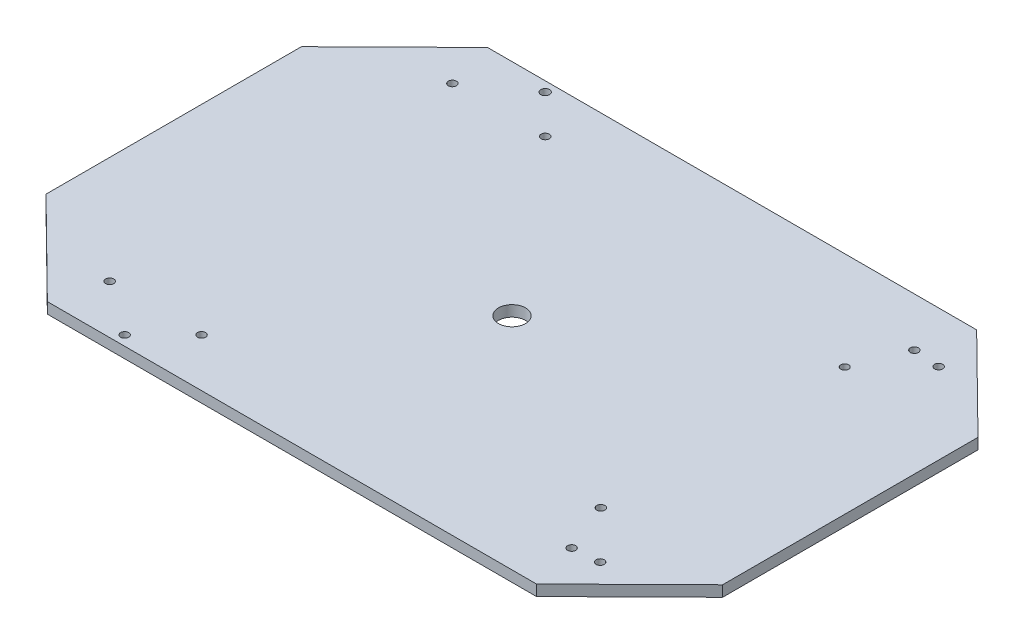
ISO-10303-21;
HEADER;
FILE_DESCRIPTION(('STEP AP214'),'2;1');
FILE_NAME('part.step','',(''),(''),'','','');
FILE_SCHEMA(('AUTOMOTIVE_DESIGN { 1 0 10303 214 1 1 1 1 }'));
ENDSEC;
DATA;
#1=APPLICATION_CONTEXT('core data for automotive mechanical design processes');
#2=APPLICATION_PROTOCOL_DEFINITION('international standard','automotive_design',2000,#1);
#3=PRODUCT_CONTEXT('',#1,'mechanical');
#4=PRODUCT('Part','Part','',(#3));
#5=PRODUCT_RELATED_PRODUCT_CATEGORY('part','',(#4));
#6=PRODUCT_DEFINITION_FORMATION('','',#4);
#7=PRODUCT_DEFINITION_CONTEXT('part definition',#1,'design');
#8=PRODUCT_DEFINITION('design','',#6,#7);
#9=PRODUCT_DEFINITION_SHAPE('','',#8);
#10=(LENGTH_UNIT() NAMED_UNIT(*) SI_UNIT(.MILLI.,.METRE.));
#11=(NAMED_UNIT(*) PLANE_ANGLE_UNIT() SI_UNIT($,.RADIAN.));
#12=(NAMED_UNIT(*) SI_UNIT($,.STERADIAN.) SOLID_ANGLE_UNIT());
#13=UNCERTAINTY_MEASURE_WITH_UNIT(LENGTH_MEASURE(1.E-05),#10,'distance_accuracy_value','');
#14=(GEOMETRIC_REPRESENTATION_CONTEXT(3) GLOBAL_UNCERTAINTY_ASSIGNED_CONTEXT((#13)) GLOBAL_UNIT_ASSIGNED_CONTEXT((#10,
#11,#12)) REPRESENTATION_CONTEXT('',''));
#15=CARTESIAN_POINT('',(0.,0.,0.));
#16=DIRECTION('',(0.,0.,1.));
#17=DIRECTION('',(1.,0.,0.));
#18=AXIS2_PLACEMENT_3D('',#15,#16,#17);
#19=CARTESIAN_POINT('',(-90.,4.,-81.));
#20=DIRECTION('',(0.701926718971864,0.,0.71224917072145));
#21=DIRECTION('',(0.71224917072145,0.,-0.701926718971864));
#22=AXIS2_PLACEMENT_3D('',#19,#20,#21);
#23=PLANE('',#22);
#24=DIRECTION('',(-0.71224917072145,0.,0.701926718971864));
#25=VECTOR('',#24,1.);
#26=CARTESIAN_POINT('',(-90.,0.,-81.));
#27=LINE('',#26,#25);
#28=CARTESIAN_POINT('',(-90.,0.,-81.));
#29=VERTEX_POINT('',#28);
#30=CARTESIAN_POINT('',(-124.5,0.,-47.));
#31=VERTEX_POINT('',#30);
#32=EDGE_CURVE('E135',#29,#31,#27,.T.);
#33=ORIENTED_EDGE('',*,*,#32,.T.);
#34=DIRECTION('',(0.,-1.,0.));
#35=VECTOR('',#34,1.);
#36=CARTESIAN_POINT('',(-124.5,4.,-47.));
#37=LINE('',#36,#35);
#38=CARTESIAN_POINT('',(-124.5,4.,-47.));
#39=VERTEX_POINT('',#38);
#40=EDGE_CURVE('E42',#39,#31,#37,.T.);
#41=ORIENTED_EDGE('',*,*,#40,.F.);
#42=DIRECTION('',(-0.71224917072145,0.,0.701926718971864));
#43=VECTOR('',#42,1.);
#44=CARTESIAN_POINT('',(-90.,4.,-81.));
#45=LINE('',#44,#43);
#46=CARTESIAN_POINT('',(-90.,4.,-81.));
#47=VERTEX_POINT('',#46);
#48=EDGE_CURVE('E95',#47,#39,#45,.T.);
#49=ORIENTED_EDGE('',*,*,#48,.F.);
#50=DIRECTION('',(0.,-1.,0.));
#51=VECTOR('',#50,1.);
#52=CARTESIAN_POINT('',(-90.,4.,-81.));
#53=LINE('',#52,#51);
#54=EDGE_CURVE('E11',#47,#29,#53,.T.);
#55=ORIENTED_EDGE('',*,*,#54,.T.);
#56=EDGE_LOOP('',(#33,#41,#49,#55));
#57=FACE_BOUND('',#56,.T.);
#58=ADVANCED_FACE('F33',(#57),#23,.F.);
#59=CARTESIAN_POINT('',(-124.5,4.,47.));
#60=DIRECTION('',(1.,0.,0.));
#61=DIRECTION('',(0.,0.,-1.));
#62=AXIS2_PLACEMENT_3D('',#59,#60,#61);
#63=PLANE('',#62);
#64=DIRECTION('',(0.,0.,1.));
#65=VECTOR('',#64,1.);
#66=CARTESIAN_POINT('',(-124.5,0.,47.));
#67=LINE('',#66,#65);
#68=CARTESIAN_POINT('',(-124.5,0.,47.));
#69=VERTEX_POINT('',#68);
#70=EDGE_CURVE('E137',#31,#69,#67,.T.);
#71=ORIENTED_EDGE('',*,*,#70,.T.);
#72=DIRECTION('',(0.,-1.,0.));
#73=VECTOR('',#72,1.);
#74=CARTESIAN_POINT('',(-124.5,4.,47.));
#75=LINE('',#74,#73);
#76=CARTESIAN_POINT('',(-124.5,4.,47.));
#77=VERTEX_POINT('',#76);
#78=EDGE_CURVE('E156',#77,#69,#75,.T.);
#79=ORIENTED_EDGE('',*,*,#78,.F.);
#80=DIRECTION('',(0.,0.,1.));
#81=VECTOR('',#80,1.);
#82=CARTESIAN_POINT('',(-124.5,4.,47.));
#83=LINE('',#82,#81);
#84=EDGE_CURVE('E218',#39,#77,#83,.T.);
#85=ORIENTED_EDGE('',*,*,#84,.F.);
#86=ORIENTED_EDGE('',*,*,#40,.T.);
#87=EDGE_LOOP('',(#71,#79,#85,#86));
#88=FACE_BOUND('',#87,.T.);
#89=ADVANCED_FACE('F238',(#88),#63,.F.);
#90=CARTESIAN_POINT('',(-90.,4.,81.));
#91=DIRECTION('',(0.701926718971864,0.,-0.71224917072145));
#92=DIRECTION('',(-0.71224917072145,0.,-0.701926718971864));
#93=AXIS2_PLACEMENT_3D('',#90,#91,#92);
#94=PLANE('',#93);
#95=DIRECTION('',(0.71224917072145,0.,0.701926718971864));
#96=VECTOR('',#95,1.);
#97=CARTESIAN_POINT('',(-90.,0.,81.));
#98=LINE('',#97,#96);
#99=CARTESIAN_POINT('',(-90.,0.,81.));
#100=VERTEX_POINT('',#99);
#101=EDGE_CURVE('E140',#69,#100,#98,.T.);
#102=ORIENTED_EDGE('',*,*,#101,.T.);
#103=DIRECTION('',(0.,-1.,0.));
#104=VECTOR('',#103,1.);
#105=CARTESIAN_POINT('',(-90.,4.,81.));
#106=LINE('',#105,#104);
#107=CARTESIAN_POINT('',(-90.,4.,81.));
#108=VERTEX_POINT('',#107);
#109=EDGE_CURVE('E153',#108,#100,#106,.T.);
#110=ORIENTED_EDGE('',*,*,#109,.F.);
#111=DIRECTION('',(0.71224917072145,0.,0.701926718971864));
#112=VECTOR('',#111,1.);
#113=CARTESIAN_POINT('',(-90.,4.,81.));
#114=LINE('',#113,#112);
#115=EDGE_CURVE('E220',#77,#108,#114,.T.);
#116=ORIENTED_EDGE('',*,*,#115,.F.);
#117=ORIENTED_EDGE('',*,*,#78,.T.);
#118=EDGE_LOOP('',(#102,#110,#116,#117));
#119=FACE_BOUND('',#118,.T.);
#120=ADVANCED_FACE('F226',(#119),#94,.F.);
#121=CARTESIAN_POINT('',(0.,4.,81.));
#122=DIRECTION('',(0.,0.,-1.));
#123=DIRECTION('',(-1.,0.,0.));
#124=AXIS2_PLACEMENT_3D('',#121,#122,#123);
#125=PLANE('',#124);
#126=DIRECTION('',(1.,0.,0.));
#127=VECTOR('',#126,1.);
#128=CARTESIAN_POINT('',(0.,0.,81.));
#129=LINE('',#128,#127);
#130=CARTESIAN_POINT('',(89.9999999999999,0.,81.));
#131=VERTEX_POINT('',#130);
#132=EDGE_CURVE('E143',#100,#131,#129,.T.);
#133=ORIENTED_EDGE('',*,*,#132,.T.);
#134=DIRECTION('',(0.,-1.,0.));
#135=VECTOR('',#134,1.);
#136=CARTESIAN_POINT('',(89.9999999999999,4.,81.));
#137=LINE('',#136,#135);
#138=CARTESIAN_POINT('',(89.9999999999999,4.,81.));
#139=VERTEX_POINT('',#138);
#140=EDGE_CURVE('E124',#139,#131,#137,.T.);
#141=ORIENTED_EDGE('',*,*,#140,.F.);
#142=DIRECTION('',(1.,0.,0.));
#143=VECTOR('',#142,1.);
#144=CARTESIAN_POINT('',(-90.,4.,81.));
#145=LINE('',#144,#143);
#146=EDGE_CURVE('E115',#108,#139,#145,.T.);
#147=ORIENTED_EDGE('',*,*,#146,.F.);
#148=ORIENTED_EDGE('',*,*,#109,.T.);
#149=EDGE_LOOP('',(#133,#141,#147,#148));
#150=FACE_BOUND('',#149,.T.);
#151=ADVANCED_FACE('F229',(#150),#125,.F.);
#152=CARTESIAN_POINT('',(124.5,4.,47.));
#153=DIRECTION('',(-0.701926718971864,0.,-0.712249170721451));
#154=DIRECTION('',(-0.712249170721451,0.,0.701926718971864));
#155=AXIS2_PLACEMENT_3D('',#152,#153,#154);
#156=PLANE('',#155);
#157=DIRECTION('',(0.712249170721451,0.,-0.701926718971864));
#158=VECTOR('',#157,1.);
#159=CARTESIAN_POINT('',(124.5,0.,47.));
#160=LINE('',#159,#158);
#161=CARTESIAN_POINT('',(124.5,0.,47.));
#162=VERTEX_POINT('',#161);
#163=EDGE_CURVE('E123',#131,#162,#160,.T.);
#164=ORIENTED_EDGE('',*,*,#163,.T.);
#165=DIRECTION('',(0.,-1.,0.));
#166=VECTOR('',#165,1.);
#167=CARTESIAN_POINT('',(124.5,4.,47.));
#168=LINE('',#167,#166);
#169=CARTESIAN_POINT('',(124.5,4.,47.));
#170=VERTEX_POINT('',#169);
#171=EDGE_CURVE('E120',#170,#162,#168,.T.);
#172=ORIENTED_EDGE('',*,*,#171,.F.);
#173=DIRECTION('',(0.712249170721451,0.,-0.701926718971864));
#174=VECTOR('',#173,1.);
#175=CARTESIAN_POINT('',(124.5,4.,47.));
#176=LINE('',#175,#174);
#177=EDGE_CURVE('E109',#139,#170,#176,.T.);
#178=ORIENTED_EDGE('',*,*,#177,.F.);
#179=ORIENTED_EDGE('',*,*,#140,.T.);
#180=EDGE_LOOP('',(#164,#172,#178,#179));
#181=FACE_BOUND('',#180,.T.);
#182=ADVANCED_FACE('F121',(#181),#156,.F.);
#183=CARTESIAN_POINT('',(124.5,4.,47.));
#184=DIRECTION('',(-1.,0.,0.));
#185=DIRECTION('',(0.,0.,1.));
#186=AXIS2_PLACEMENT_3D('',#183,#184,#185);
#187=PLANE('',#186);
#188=DIRECTION('',(0.,0.,-1.));
#189=VECTOR('',#188,1.);
#190=CARTESIAN_POINT('',(124.5,0.,47.));
#191=LINE('',#190,#189);
#192=CARTESIAN_POINT('',(124.5,0.,-47.));
#193=VERTEX_POINT('',#192);
#194=EDGE_CURVE('E81',#162,#193,#191,.T.);
#195=ORIENTED_EDGE('',*,*,#194,.T.);
#196=DIRECTION('',(0.,-1.,0.));
#197=VECTOR('',#196,1.);
#198=CARTESIAN_POINT('',(124.5,4.,-47.));
#199=LINE('',#198,#197);
#200=CARTESIAN_POINT('',(124.5,4.,-47.));
#201=VERTEX_POINT('',#200);
#202=EDGE_CURVE('E125',#201,#193,#199,.T.);
#203=ORIENTED_EDGE('',*,*,#202,.F.);
#204=DIRECTION('',(0.,0.,-1.));
#205=VECTOR('',#204,1.);
#206=CARTESIAN_POINT('',(124.5,4.,47.));
#207=LINE('',#206,#205);
#208=EDGE_CURVE('E113',#170,#201,#207,.T.);
#209=ORIENTED_EDGE('',*,*,#208,.F.);
#210=ORIENTED_EDGE('',*,*,#171,.T.);
#211=EDGE_LOOP('',(#195,#203,#209,#210));
#212=FACE_BOUND('',#211,.T.);
#213=ADVANCED_FACE('F127',(#212),#187,.F.);
#214=CARTESIAN_POINT('',(124.5,4.,-47.));
#215=DIRECTION('',(-0.701926718971864,0.,0.712249170721451));
#216=DIRECTION('',(0.712249170721451,0.,0.701926718971864));
#217=AXIS2_PLACEMENT_3D('',#214,#215,#216);
#218=PLANE('',#217);
#219=DIRECTION('',(-0.712249170721451,0.,-0.701926718971864));
#220=VECTOR('',#219,1.);
#221=CARTESIAN_POINT('',(124.5,0.,-47.));
#222=LINE('',#221,#220);
#223=CARTESIAN_POINT('',(90.,0.,-81.));
#224=VERTEX_POINT('',#223);
#225=EDGE_CURVE('E88',#193,#224,#222,.T.);
#226=ORIENTED_EDGE('',*,*,#225,.T.);
#227=DIRECTION('',(0.,-1.,0.));
#228=VECTOR('',#227,1.);
#229=CARTESIAN_POINT('',(90.,4.,-81.));
#230=LINE('',#229,#228);
#231=CARTESIAN_POINT('',(90.,4.,-81.));
#232=VERTEX_POINT('',#231);
#233=EDGE_CURVE('E131',#232,#224,#230,.T.);
#234=ORIENTED_EDGE('',*,*,#233,.F.);
#235=DIRECTION('',(-0.712249170721451,0.,-0.701926718971864));
#236=VECTOR('',#235,1.);
#237=CARTESIAN_POINT('',(124.5,4.,-47.));
#238=LINE('',#237,#236);
#239=EDGE_CURVE('E129',#201,#232,#238,.T.);
#240=ORIENTED_EDGE('',*,*,#239,.F.);
#241=ORIENTED_EDGE('',*,*,#202,.T.);
#242=EDGE_LOOP('',(#226,#234,#240,#241));
#243=FACE_BOUND('',#242,.T.);
#244=ADVANCED_FACE('F236',(#243),#218,.F.);
#245=CARTESIAN_POINT('',(0.,4.,-81.));
#246=DIRECTION('',(0.,0.,1.));
#247=DIRECTION('',(1.,0.,0.));
#248=AXIS2_PLACEMENT_3D('',#245,#246,#247);
#249=PLANE('',#248);
#250=DIRECTION('',(-1.,0.,0.));
#251=VECTOR('',#250,1.);
#252=CARTESIAN_POINT('',(0.,0.,-81.));
#253=LINE('',#252,#251);
#254=EDGE_CURVE('E148',#224,#29,#253,.T.);
#255=ORIENTED_EDGE('',*,*,#254,.T.);
#256=ORIENTED_EDGE('',*,*,#54,.F.);
#257=DIRECTION('',(-1.,0.,0.));
#258=VECTOR('',#257,1.);
#259=CARTESIAN_POINT('',(-90.,4.,-81.));
#260=LINE('',#259,#258);
#261=EDGE_CURVE('E51',#232,#47,#260,.T.);
#262=ORIENTED_EDGE('',*,*,#261,.F.);
#263=ORIENTED_EDGE('',*,*,#233,.T.);
#264=EDGE_LOOP('',(#255,#256,#262,#263));
#265=FACE_BOUND('',#264,.T.);
#266=ADVANCED_FACE('F235',(#265),#249,.F.);
#267=CARTESIAN_POINT('',(0.,4.,0.));
#268=DIRECTION('',(0.,1.,0.));
#269=DIRECTION('',(0.,0.,1.));
#270=AXIS2_PLACEMENT_3D('',#267,#268,#269);
#271=PLANE('',#270);
#272=CARTESIAN_POINT('',(0.,4.,0.));
#273=DIRECTION('',(0.,1.,0.));
#274=DIRECTION('',(0.,0.,1.));
#275=AXIS2_PLACEMENT_3D('',#272,#273,#274);
#276=CIRCLE('',#275,5.);
#277=CARTESIAN_POINT('',(0.,4.,5.));
#278=VERTEX_POINT('',#277);
#279=EDGE_CURVE('E317',#278,#278,#276,.T.);
#280=ORIENTED_EDGE('',*,*,#279,.F.);
#281=EDGE_LOOP('',(#280));
#282=FACE_BOUND('',#281,.T.);
#283=CARTESIAN_POINT('',(-51.0264828364684,4.,63.2396862720649));
#284=DIRECTION('',(0.,1.,0.));
#285=DIRECTION('',(0.,0.,1.));
#286=AXIS2_PLACEMENT_3D('',#283,#284,#285);
#287=CIRCLE('',#286,1.5);
#288=CARTESIAN_POINT('',(-51.0264828364684,4.,64.7396862720649));
#289=VERTEX_POINT('',#288);
#290=EDGE_CURVE('E322',#289,#289,#287,.T.);
#291=ORIENTED_EDGE('',*,*,#290,.F.);
#292=EDGE_LOOP('',(#291));
#293=FACE_BOUND('',#292,.T.);
#294=CARTESIAN_POINT('',(-65.1686184601994,4.,77.3818218957958));
#295=DIRECTION('',(0.,1.,0.));
#296=DIRECTION('',(0.,0.,1.));
#297=AXIS2_PLACEMENT_3D('',#294,#295,#296);
#298=CIRCLE('',#297,1.50000000000001);
#299=CARTESIAN_POINT('',(-65.1686184601994,4.,78.8818218957959));
#300=VERTEX_POINT('',#299);
#301=EDGE_CURVE('E331',#300,#300,#298,.T.);
#302=ORIENTED_EDGE('',*,*,#301,.F.);
#303=EDGE_LOOP('',(#302));
#304=FACE_BOUND('',#303,.T.);
#305=CARTESIAN_POINT('',(-51.0264828364684,4.,-63.2396862720649));
#306=DIRECTION('',(0.,1.,0.));
#307=DIRECTION('',(0.,0.,1.));
#308=AXIS2_PLACEMENT_3D('',#305,#306,#307);
#309=CIRCLE('',#308,1.5);
#310=CARTESIAN_POINT('',(-51.0264828364684,4.,-61.7396862720649));
#311=VERTEX_POINT('',#310);
#312=EDGE_CURVE('E337',#311,#311,#309,.T.);
#313=ORIENTED_EDGE('',*,*,#312,.F.);
#314=EDGE_LOOP('',(#313));
#315=FACE_BOUND('',#314,.T.);
#316=CARTESIAN_POINT('',(-65.1686184601994,4.,-77.3818218957958));
#317=DIRECTION('',(0.,1.,0.));
#318=DIRECTION('',(0.,0.,1.));
#319=AXIS2_PLACEMENT_3D('',#316,#317,#318);
#320=CIRCLE('',#319,1.62091576201547);
#321=CARTESIAN_POINT('',(-65.1686184601994,4.,-75.7609061337804));
#322=VERTEX_POINT('',#321);
#323=EDGE_CURVE('E195',#322,#322,#320,.T.);
#324=ORIENTED_EDGE('',*,*,#323,.F.);
#325=EDGE_LOOP('',(#324));
#326=FACE_BOUND('',#325,.T.);
#327=CARTESIAN_POINT('',(94.7328441271853,4.,-62.2957174297497));
#328=DIRECTION('',(0.,1.,0.));
#329=DIRECTION('',(0.,0.,1.));
#330=AXIS2_PLACEMENT_3D('',#327,#328,#329);
#331=CIRCLE('',#330,1.5);
#332=CARTESIAN_POINT('',(94.7328441271853,4.,-60.7957174297498));
#333=VERTEX_POINT('',#332);
#334=EDGE_CURVE('E189',#333,#333,#331,.T.);
#335=ORIENTED_EDGE('',*,*,#334,.F.);
#336=EDGE_LOOP('',(#335));
#337=FACE_BOUND('',#336,.T.);
#338=CARTESIAN_POINT('',(77.5634914725108,4.,-44.8738742948594));
#339=DIRECTION('',(0.,1.,0.));
#340=DIRECTION('',(0.,0.,1.));
#341=AXIS2_PLACEMENT_3D('',#338,#339,#340);
#342=CIRCLE('',#341,1.43914357487429);
#343=CARTESIAN_POINT('',(77.5634914725108,4.,-43.4347307199851));
#344=VERTEX_POINT('',#343);
#345=EDGE_CURVE('E186',#344,#344,#342,.T.);
#346=ORIENTED_EDGE('',*,*,#345,.F.);
#347=EDGE_LOOP('',(#346));
#348=FACE_BOUND('',#347,.T.);
#349=CARTESIAN_POINT('',(77.5634914725108,4.,44.8738742948594));
#350=DIRECTION('',(0.,1.,0.));
#351=DIRECTION('',(0.,0.,1.));
#352=AXIS2_PLACEMENT_3D('',#349,#350,#351);
#353=CIRCLE('',#352,1.5);
#354=CARTESIAN_POINT('',(77.5634914725108,4.,46.3738742948594));
#355=VERTEX_POINT('',#354);
#356=EDGE_CURVE('E183',#355,#355,#353,.T.);
#357=ORIENTED_EDGE('',*,*,#356,.F.);
#358=EDGE_LOOP('',(#357));
#359=FACE_BOUND('',#358,.T.);
#360=CARTESIAN_POINT('',(94.7328441271853,4.,62.2957174297497));
#361=DIRECTION('',(0.,1.,0.));
#362=DIRECTION('',(0.,0.,1.));
#363=AXIS2_PLACEMENT_3D('',#360,#361,#362);
#364=CIRCLE('',#363,1.5);
#365=CARTESIAN_POINT('',(94.7328441271853,4.,63.7957174297497));
#366=VERTEX_POINT('',#365);
#367=EDGE_CURVE('E179',#366,#366,#364,.T.);
#368=ORIENTED_EDGE('',*,*,#367,.F.);
#369=EDGE_LOOP('',(#368));
#370=FACE_BOUND('',#369,.T.);
#371=CARTESIAN_POINT('',(85.,4.,-63.060809699476));
#372=DIRECTION('',(0.,1.,0.));
#373=DIRECTION('',(0.,0.,1.));
#374=AXIS2_PLACEMENT_3D('',#371,#372,#373);
#375=CIRCLE('',#374,1.5);
#376=CARTESIAN_POINT('',(85.,4.,-61.560809699476));
#377=VERTEX_POINT('',#376);
#378=EDGE_CURVE('E175',#377,#377,#375,.T.);
#379=ORIENTED_EDGE('',*,*,#378,.F.);
#380=EDGE_LOOP('',(#379));
#381=FACE_BOUND('',#380,.T.);
#382=CARTESIAN_POINT('',(85.,4.,63.060809699476));
#383=DIRECTION('',(0.,1.,0.));
#384=DIRECTION('',(0.,0.,1.));
#385=AXIS2_PLACEMENT_3D('',#382,#383,#384);
#386=CIRCLE('',#385,1.5);
#387=CARTESIAN_POINT('',(85.,4.,64.560809699476));
#388=VERTEX_POINT('',#387);
#389=EDGE_CURVE('E171',#388,#388,#386,.T.);
#390=ORIENTED_EDGE('',*,*,#389,.F.);
#391=EDGE_LOOP('',(#390));
#392=FACE_BOUND('',#391,.T.);
#393=CARTESIAN_POINT('',(-85.,4.,63.0608096994761));
#394=DIRECTION('',(0.,1.,0.));
#395=DIRECTION('',(0.,0.,1.));
#396=AXIS2_PLACEMENT_3D('',#393,#394,#395);
#397=CIRCLE('',#396,1.5);
#398=CARTESIAN_POINT('',(-85.,4.,64.5608096994761));
#399=VERTEX_POINT('',#398);
#400=EDGE_CURVE('E167',#399,#399,#397,.T.);
#401=ORIENTED_EDGE('',*,*,#400,.F.);
#402=EDGE_LOOP('',(#401));
#403=FACE_BOUND('',#402,.T.);
#404=CARTESIAN_POINT('',(-85.,4.,-63.060809699476));
#405=DIRECTION('',(0.,1.,0.));
#406=DIRECTION('',(0.,0.,1.));
#407=AXIS2_PLACEMENT_3D('',#404,#405,#406);
#408=CIRCLE('',#407,1.5);
#409=CARTESIAN_POINT('',(-85.,4.,-61.560809699476));
#410=VERTEX_POINT('',#409);
#411=EDGE_CURVE('E163',#410,#410,#408,.T.);
#412=ORIENTED_EDGE('',*,*,#411,.F.);
#413=EDGE_LOOP('',(#412));
#414=FACE_BOUND('',#413,.T.);
#415=ORIENTED_EDGE('',*,*,#261,.T.);
#416=ORIENTED_EDGE('',*,*,#48,.T.);
#417=ORIENTED_EDGE('',*,*,#84,.T.);
#418=ORIENTED_EDGE('',*,*,#115,.T.);
#419=ORIENTED_EDGE('',*,*,#146,.T.);
#420=ORIENTED_EDGE('',*,*,#177,.T.);
#421=ORIENTED_EDGE('',*,*,#208,.T.);
#422=ORIENTED_EDGE('',*,*,#239,.T.);
#423=EDGE_LOOP('',(#415,#416,#417,#418,#419,#420,#421,#422));
#424=FACE_BOUND('',#423,.T.);
#425=ADVANCED_FACE('F111',(#282,#293,#304,#315,#326,#337,#348,#359,#370,#381,#392,#403,#414,
#424),#271,.T.);
#426=CARTESIAN_POINT('',(0.,0.,0.));
#427=DIRECTION('',(0.,1.,0.));
#428=DIRECTION('',(0.,0.,1.));
#429=AXIS2_PLACEMENT_3D('',#426,#427,#428);
#430=PLANE('',#429);
#431=CARTESIAN_POINT('',(0.,0.,0.));
#432=DIRECTION('',(0.,1.,0.));
#433=DIRECTION('',(0.,0.,1.));
#434=AXIS2_PLACEMENT_3D('',#431,#432,#433);
#435=CIRCLE('',#434,5.);
#436=CARTESIAN_POINT('',(0.,0.,5.));
#437=VERTEX_POINT('',#436);
#438=EDGE_CURVE('E36',#437,#437,#435,.T.);
#439=ORIENTED_EDGE('',*,*,#438,.T.);
#440=EDGE_LOOP('',(#439));
#441=FACE_BOUND('',#440,.T.);
#442=CARTESIAN_POINT('',(-51.0264828364684,0.,63.2396862720649));
#443=DIRECTION('',(0.,-1.,0.));
#444=DIRECTION('',(0.,0.,-1.));
#445=AXIS2_PLACEMENT_3D('',#442,#443,#444);
#446=CIRCLE('',#445,1.5);
#447=CARTESIAN_POINT('',(-51.0264828364684,0.,61.7396862720649));
#448=VERTEX_POINT('',#447);
#449=EDGE_CURVE('E320',#448,#448,#446,.T.);
#450=ORIENTED_EDGE('',*,*,#449,.F.);
#451=EDGE_LOOP('',(#450));
#452=FACE_BOUND('',#451,.T.);
#453=CARTESIAN_POINT('',(-65.1686184601994,0.,77.3818218957958));
#454=DIRECTION('',(0.,-1.,0.));
#455=DIRECTION('',(0.,0.,-1.));
#456=AXIS2_PLACEMENT_3D('',#453,#454,#455);
#457=CIRCLE('',#456,1.50000000000001);
#458=CARTESIAN_POINT('',(-65.1686184601994,0.,75.8818218957958));
#459=VERTEX_POINT('',#458);
#460=EDGE_CURVE('E328',#459,#459,#457,.T.);
#461=ORIENTED_EDGE('',*,*,#460,.F.);
#462=EDGE_LOOP('',(#461));
#463=FACE_BOUND('',#462,.T.);
#464=CARTESIAN_POINT('',(-51.0264828364684,0.,-63.2396862720649));
#465=DIRECTION('',(0.,-1.,0.));
#466=DIRECTION('',(0.,0.,-1.));
#467=AXIS2_PLACEMENT_3D('',#464,#465,#466);
#468=CIRCLE('',#467,1.5);
#469=CARTESIAN_POINT('',(-51.0264828364684,0.,-64.7396862720649));
#470=VERTEX_POINT('',#469);
#471=EDGE_CURVE('E334',#470,#470,#468,.T.);
#472=ORIENTED_EDGE('',*,*,#471,.F.);
#473=EDGE_LOOP('',(#472));
#474=FACE_BOUND('',#473,.T.);
#475=CARTESIAN_POINT('',(-65.1686184601994,0.,-77.3818218957958));
#476=DIRECTION('',(0.,-1.,0.));
#477=DIRECTION('',(0.,0.,-1.));
#478=AXIS2_PLACEMENT_3D('',#475,#476,#477);
#479=CIRCLE('',#478,1.62091576201547);
#480=CARTESIAN_POINT('',(-65.1686184601994,0.,-79.0027376578113));
#481=VERTEX_POINT('',#480);
#482=EDGE_CURVE('E200',#481,#481,#479,.T.);
#483=ORIENTED_EDGE('',*,*,#482,.F.);
#484=EDGE_LOOP('',(#483));
#485=FACE_BOUND('',#484,.T.);
#486=CARTESIAN_POINT('',(94.7328441271853,0.,-62.2957174297497));
#487=DIRECTION('',(0.,1.,0.));
#488=DIRECTION('',(0.,0.,1.));
#489=AXIS2_PLACEMENT_3D('',#486,#487,#488);
#490=CIRCLE('',#489,1.5);
#491=CARTESIAN_POINT('',(94.7328441271853,0.,-60.7957174297498));
#492=VERTEX_POINT('',#491);
#493=EDGE_CURVE('E187',#492,#492,#490,.T.);
#494=ORIENTED_EDGE('',*,*,#493,.T.);
#495=EDGE_LOOP('',(#494));
#496=FACE_BOUND('',#495,.T.);
#497=CARTESIAN_POINT('',(77.5634914725108,0.,-44.8738742948594));
#498=DIRECTION('',(0.,1.,0.));
#499=DIRECTION('',(0.,0.,1.));
#500=AXIS2_PLACEMENT_3D('',#497,#498,#499);
#501=CIRCLE('',#500,1.43914357487429);
#502=CARTESIAN_POINT('',(77.5634914725108,0.,-43.4347307199851));
#503=VERTEX_POINT('',#502);
#504=EDGE_CURVE('E184',#503,#503,#501,.T.);
#505=ORIENTED_EDGE('',*,*,#504,.T.);
#506=EDGE_LOOP('',(#505));
#507=FACE_BOUND('',#506,.T.);
#508=CARTESIAN_POINT('',(77.5634914725108,0.,44.8738742948594));
#509=DIRECTION('',(0.,1.,0.));
#510=DIRECTION('',(0.,0.,1.));
#511=AXIS2_PLACEMENT_3D('',#508,#509,#510);
#512=CIRCLE('',#511,1.5);
#513=CARTESIAN_POINT('',(77.5634914725108,0.,46.3738742948594));
#514=VERTEX_POINT('',#513);
#515=EDGE_CURVE('E180',#514,#514,#512,.T.);
#516=ORIENTED_EDGE('',*,*,#515,.T.);
#517=EDGE_LOOP('',(#516));
#518=FACE_BOUND('',#517,.T.);
#519=CARTESIAN_POINT('',(94.7328441271853,0.,62.2957174297497));
#520=DIRECTION('',(0.,1.,0.));
#521=DIRECTION('',(0.,0.,1.));
#522=AXIS2_PLACEMENT_3D('',#519,#520,#521);
#523=CIRCLE('',#522,1.5);
#524=CARTESIAN_POINT('',(94.7328441271853,0.,63.7957174297497));
#525=VERTEX_POINT('',#524);
#526=EDGE_CURVE('E176',#525,#525,#523,.T.);
#527=ORIENTED_EDGE('',*,*,#526,.T.);
#528=EDGE_LOOP('',(#527));
#529=FACE_BOUND('',#528,.T.);
#530=CARTESIAN_POINT('',(85.,0.,-63.060809699476));
#531=DIRECTION('',(0.,1.,0.));
#532=DIRECTION('',(0.,0.,1.));
#533=AXIS2_PLACEMENT_3D('',#530,#531,#532);
#534=CIRCLE('',#533,1.5);
#535=CARTESIAN_POINT('',(85.,0.,-61.560809699476));
#536=VERTEX_POINT('',#535);
#537=EDGE_CURVE('E172',#536,#536,#534,.T.);
#538=ORIENTED_EDGE('',*,*,#537,.T.);
#539=EDGE_LOOP('',(#538));
#540=FACE_BOUND('',#539,.T.);
#541=CARTESIAN_POINT('',(85.,0.,63.060809699476));
#542=DIRECTION('',(0.,1.,0.));
#543=DIRECTION('',(0.,0.,1.));
#544=AXIS2_PLACEMENT_3D('',#541,#542,#543);
#545=CIRCLE('',#544,1.5);
#546=CARTESIAN_POINT('',(85.,0.,64.560809699476));
#547=VERTEX_POINT('',#546);
#548=EDGE_CURVE('E168',#547,#547,#545,.T.);
#549=ORIENTED_EDGE('',*,*,#548,.T.);
#550=EDGE_LOOP('',(#549));
#551=FACE_BOUND('',#550,.T.);
#552=CARTESIAN_POINT('',(-85.,0.,63.0608096994761));
#553=DIRECTION('',(0.,1.,0.));
#554=DIRECTION('',(0.,0.,1.));
#555=AXIS2_PLACEMENT_3D('',#552,#553,#554);
#556=CIRCLE('',#555,1.5);
#557=CARTESIAN_POINT('',(-85.,0.,64.5608096994761));
#558=VERTEX_POINT('',#557);
#559=EDGE_CURVE('E164',#558,#558,#556,.T.);
#560=ORIENTED_EDGE('',*,*,#559,.T.);
#561=EDGE_LOOP('',(#560));
#562=FACE_BOUND('',#561,.T.);
#563=CARTESIAN_POINT('',(-85.,0.,-63.060809699476));
#564=DIRECTION('',(0.,1.,0.));
#565=DIRECTION('',(0.,0.,1.));
#566=AXIS2_PLACEMENT_3D('',#563,#564,#565);
#567=CIRCLE('',#566,1.5);
#568=CARTESIAN_POINT('',(-85.,0.,-61.560809699476));
#569=VERTEX_POINT('',#568);
#570=EDGE_CURVE('E138',#569,#569,#567,.T.);
#571=ORIENTED_EDGE('',*,*,#570,.T.);
#572=EDGE_LOOP('',(#571));
#573=FACE_BOUND('',#572,.T.);
#574=ORIENTED_EDGE('',*,*,#32,.F.);
#575=ORIENTED_EDGE('',*,*,#254,.F.);
#576=ORIENTED_EDGE('',*,*,#225,.F.);
#577=ORIENTED_EDGE('',*,*,#194,.F.);
#578=ORIENTED_EDGE('',*,*,#163,.F.);
#579=ORIENTED_EDGE('',*,*,#132,.F.);
#580=ORIENTED_EDGE('',*,*,#101,.F.);
#581=ORIENTED_EDGE('',*,*,#70,.F.);
#582=EDGE_LOOP('',(#574,#575,#576,#577,#578,#579,#580,#581));
#583=FACE_BOUND('',#582,.T.);
#584=ADVANCED_FACE('F232',(#441,#452,#463,#474,#485,#496,#507,#518,#529,#540,#551,#562,#573,
#583),#430,.F.);
#585=CARTESIAN_POINT('',(-85.,-6.,-63.060809699476));
#586=DIRECTION('',(0.,1.,0.));
#587=DIRECTION('',(0.,0.,1.));
#588=AXIS2_PLACEMENT_3D('',#585,#586,#587);
#589=CYLINDRICAL_SURFACE('',#588,1.5);
#590=ORIENTED_EDGE('',*,*,#411,.T.);
#591=EDGE_LOOP('',(#590));
#592=FACE_BOUND('',#591,.T.);
#593=ORIENTED_EDGE('',*,*,#570,.F.);
#594=EDGE_LOOP('',(#593));
#595=FACE_BOUND('',#594,.T.);
#596=ADVANCED_FACE('F258',(#592,#595),#589,.F.);
#597=CARTESIAN_POINT('',(-85.,-6.,63.0608096994761));
#598=DIRECTION('',(0.,1.,0.));
#599=DIRECTION('',(0.,0.,1.));
#600=AXIS2_PLACEMENT_3D('',#597,#598,#599);
#601=CYLINDRICAL_SURFACE('',#600,1.5);
#602=ORIENTED_EDGE('',*,*,#400,.T.);
#603=EDGE_LOOP('',(#602));
#604=FACE_BOUND('',#603,.T.);
#605=ORIENTED_EDGE('',*,*,#559,.F.);
#606=EDGE_LOOP('',(#605));
#607=FACE_BOUND('',#606,.T.);
#608=ADVANCED_FACE('F265',(#604,#607),#601,.F.);
#609=CARTESIAN_POINT('',(85.,-6.,63.060809699476));
#610=DIRECTION('',(0.,1.,0.));
#611=DIRECTION('',(0.,0.,1.));
#612=AXIS2_PLACEMENT_3D('',#609,#610,#611);
#613=CYLINDRICAL_SURFACE('',#612,1.5);
#614=ORIENTED_EDGE('',*,*,#389,.T.);
#615=EDGE_LOOP('',(#614));
#616=FACE_BOUND('',#615,.T.);
#617=ORIENTED_EDGE('',*,*,#548,.F.);
#618=EDGE_LOOP('',(#617));
#619=FACE_BOUND('',#618,.T.);
#620=ADVANCED_FACE('F269',(#616,#619),#613,.F.);
#621=CARTESIAN_POINT('',(85.,-6.,-63.060809699476));
#622=DIRECTION('',(0.,1.,0.));
#623=DIRECTION('',(0.,0.,1.));
#624=AXIS2_PLACEMENT_3D('',#621,#622,#623);
#625=CYLINDRICAL_SURFACE('',#624,1.5);
#626=ORIENTED_EDGE('',*,*,#378,.T.);
#627=EDGE_LOOP('',(#626));
#628=FACE_BOUND('',#627,.T.);
#629=ORIENTED_EDGE('',*,*,#537,.F.);
#630=EDGE_LOOP('',(#629));
#631=FACE_BOUND('',#630,.T.);
#632=ADVANCED_FACE('F273',(#628,#631),#625,.F.);
#633=CARTESIAN_POINT('',(94.7328441271853,-6.,62.2957174297497));
#634=DIRECTION('',(0.,1.,0.));
#635=DIRECTION('',(0.,0.,1.));
#636=AXIS2_PLACEMENT_3D('',#633,#634,#635);
#637=CYLINDRICAL_SURFACE('',#636,1.5);
#638=ORIENTED_EDGE('',*,*,#367,.T.);
#639=EDGE_LOOP('',(#638));
#640=FACE_BOUND('',#639,.T.);
#641=ORIENTED_EDGE('',*,*,#526,.F.);
#642=EDGE_LOOP('',(#641));
#643=FACE_BOUND('',#642,.T.);
#644=ADVANCED_FACE('F277',(#640,#643),#637,.F.);
#645=CARTESIAN_POINT('',(77.5634914725108,-6.,44.8738742948594));
#646=DIRECTION('',(0.,1.,0.));
#647=DIRECTION('',(0.,0.,1.));
#648=AXIS2_PLACEMENT_3D('',#645,#646,#647);
#649=CYLINDRICAL_SURFACE('',#648,1.5);
#650=ORIENTED_EDGE('',*,*,#356,.T.);
#651=EDGE_LOOP('',(#650));
#652=FACE_BOUND('',#651,.T.);
#653=ORIENTED_EDGE('',*,*,#515,.F.);
#654=EDGE_LOOP('',(#653));
#655=FACE_BOUND('',#654,.T.);
#656=ADVANCED_FACE('F281',(#652,#655),#649,.F.);
#657=CARTESIAN_POINT('',(77.5634914725108,-6.,-44.8738742948594));
#658=DIRECTION('',(0.,1.,0.));
#659=DIRECTION('',(0.,0.,1.));
#660=AXIS2_PLACEMENT_3D('',#657,#658,#659);
#661=CYLINDRICAL_SURFACE('',#660,1.43914357487429);
#662=ORIENTED_EDGE('',*,*,#345,.T.);
#663=EDGE_LOOP('',(#662));
#664=FACE_BOUND('',#663,.T.);
#665=ORIENTED_EDGE('',*,*,#504,.F.);
#666=EDGE_LOOP('',(#665));
#667=FACE_BOUND('',#666,.T.);
#668=ADVANCED_FACE('F285',(#664,#667),#661,.F.);
#669=CARTESIAN_POINT('',(94.7328441271853,-6.,-62.2957174297497));
#670=DIRECTION('',(0.,1.,0.));
#671=DIRECTION('',(0.,0.,1.));
#672=AXIS2_PLACEMENT_3D('',#669,#670,#671);
#673=CYLINDRICAL_SURFACE('',#672,1.5);
#674=ORIENTED_EDGE('',*,*,#334,.T.);
#675=EDGE_LOOP('',(#674));
#676=FACE_BOUND('',#675,.T.);
#677=ORIENTED_EDGE('',*,*,#493,.F.);
#678=EDGE_LOOP('',(#677));
#679=FACE_BOUND('',#678,.T.);
#680=ADVANCED_FACE('F289',(#676,#679),#673,.F.);
#681=CARTESIAN_POINT('',(-65.1686184601994,50.,-77.3818218957958));
#682=DIRECTION('',(0.,-1.,0.));
#683=DIRECTION('',(0.,0.,-1.));
#684=AXIS2_PLACEMENT_3D('',#681,#682,#683);
#685=CYLINDRICAL_SURFACE('',#684,1.62091576201547);
#686=ORIENTED_EDGE('',*,*,#323,.T.);
#687=EDGE_LOOP('',(#686));
#688=FACE_BOUND('',#687,.T.);
#689=ORIENTED_EDGE('',*,*,#482,.T.);
#690=EDGE_LOOP('',(#689));
#691=FACE_BOUND('',#690,.T.);
#692=ADVANCED_FACE('F293',(#688,#691),#685,.F.);
#693=CARTESIAN_POINT('',(-51.0264828364684,50.,-63.2396862720649));
#694=DIRECTION('',(0.,-1.,0.));
#695=DIRECTION('',(0.,0.,-1.));
#696=AXIS2_PLACEMENT_3D('',#693,#694,#695);
#697=CYLINDRICAL_SURFACE('',#696,1.5);
#698=ORIENTED_EDGE('',*,*,#312,.T.);
#699=EDGE_LOOP('',(#698));
#700=FACE_BOUND('',#699,.T.);
#701=ORIENTED_EDGE('',*,*,#471,.T.);
#702=EDGE_LOOP('',(#701));
#703=FACE_BOUND('',#702,.T.);
#704=ADVANCED_FACE('F296',(#700,#703),#697,.F.);
#705=CARTESIAN_POINT('',(-65.1686184601994,50.,77.3818218957958));
#706=DIRECTION('',(0.,-1.,0.));
#707=DIRECTION('',(0.,0.,-1.));
#708=AXIS2_PLACEMENT_3D('',#705,#706,#707);
#709=CYLINDRICAL_SURFACE('',#708,1.50000000000001);
#710=ORIENTED_EDGE('',*,*,#301,.T.);
#711=EDGE_LOOP('',(#710));
#712=FACE_BOUND('',#711,.T.);
#713=ORIENTED_EDGE('',*,*,#460,.T.);
#714=EDGE_LOOP('',(#713));
#715=FACE_BOUND('',#714,.T.);
#716=ADVANCED_FACE('F300',(#712,#715),#709,.F.);
#717=CARTESIAN_POINT('',(-51.0264828364684,50.,63.2396862720649));
#718=DIRECTION('',(0.,-1.,0.));
#719=DIRECTION('',(0.,0.,-1.));
#720=AXIS2_PLACEMENT_3D('',#717,#718,#719);
#721=CYLINDRICAL_SURFACE('',#720,1.5);
#722=ORIENTED_EDGE('',*,*,#290,.T.);
#723=EDGE_LOOP('',(#722));
#724=FACE_BOUND('',#723,.T.);
#725=ORIENTED_EDGE('',*,*,#449,.T.);
#726=EDGE_LOOP('',(#725));
#727=FACE_BOUND('',#726,.T.);
#728=ADVANCED_FACE('F304',(#724,#727),#721,.F.);
#729=CARTESIAN_POINT('',(0.,-6.,0.));
#730=DIRECTION('',(0.,1.,0.));
#731=DIRECTION('',(0.,0.,1.));
#732=AXIS2_PLACEMENT_3D('',#729,#730,#731);
#733=CYLINDRICAL_SURFACE('',#732,5.);
#734=ORIENTED_EDGE('',*,*,#279,.T.);
#735=EDGE_LOOP('',(#734));
#736=FACE_BOUND('',#735,.T.);
#737=ORIENTED_EDGE('',*,*,#438,.F.);
#738=EDGE_LOOP('',(#737));
#739=FACE_BOUND('',#738,.T.);
#740=ADVANCED_FACE('F308',(#736,#739),#733,.F.);
#741=CLOSED_SHELL('',(#58,#89,#120,#151,#182,#213,#244,#266,#425,#584,#596,#608,#620,#632,#644,
#656,#668,#680,#692,#704,#716,#728,#740));
#742=MANIFOLD_SOLID_BREP('B2',#741);
#743=ADVANCED_BREP_SHAPE_REPRESENTATION('',(#18,#742),#14);
#744=SHAPE_DEFINITION_REPRESENTATION(#9,#743);
ENDSEC;
END-ISO-10303-21;
